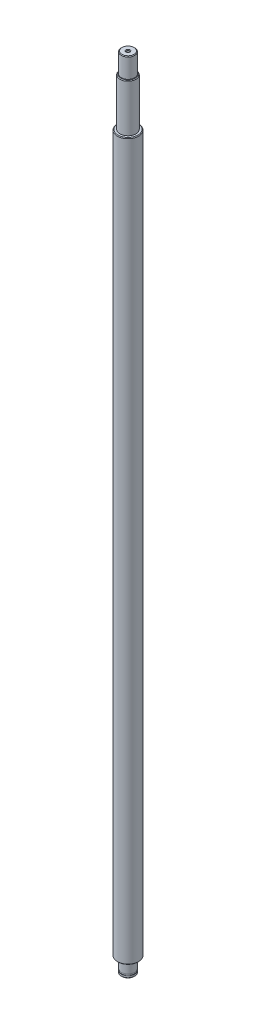
ISO-10303-21;
HEADER;
FILE_DESCRIPTION(('STEP AP214'),'2;1');
FILE_NAME('part.step','',(''),(''),'','','');
FILE_SCHEMA(('AUTOMOTIVE_DESIGN { 1 0 10303 214 1 1 1 1 }'));
ENDSEC;
DATA;
#1=APPLICATION_CONTEXT('core data for automotive mechanical design processes');
#2=APPLICATION_PROTOCOL_DEFINITION('international standard','automotive_design',2000,#1);
#3=PRODUCT_CONTEXT('',#1,'mechanical');
#4=PRODUCT('Part','Part','',(#3));
#5=PRODUCT_RELATED_PRODUCT_CATEGORY('part','',(#4));
#6=PRODUCT_DEFINITION_FORMATION('','',#4);
#7=PRODUCT_DEFINITION_CONTEXT('part definition',#1,'design');
#8=PRODUCT_DEFINITION('design','',#6,#7);
#9=PRODUCT_DEFINITION_SHAPE('','',#8);
#10=(LENGTH_UNIT() NAMED_UNIT(*) SI_UNIT(.MILLI.,.METRE.));
#11=(NAMED_UNIT(*) PLANE_ANGLE_UNIT() SI_UNIT($,.RADIAN.));
#12=(NAMED_UNIT(*) SI_UNIT($,.STERADIAN.) SOLID_ANGLE_UNIT());
#13=UNCERTAINTY_MEASURE_WITH_UNIT(LENGTH_MEASURE(1.E-05),#10,'distance_accuracy_value','');
#14=(GEOMETRIC_REPRESENTATION_CONTEXT(3) GLOBAL_UNCERTAINTY_ASSIGNED_CONTEXT((#13)) GLOBAL_UNIT_ASSIGNED_CONTEXT((#10,
#11,#12)) REPRESENTATION_CONTEXT('',''));
#15=CARTESIAN_POINT('',(0.,0.,0.));
#16=DIRECTION('',(0.,0.,1.));
#17=DIRECTION('',(1.,0.,0.));
#18=AXIS2_PLACEMENT_3D('',#15,#16,#17);
#19=CARTESIAN_POINT('',(0.,-3.,0.));
#20=DIRECTION('',(0.,1.,0.));
#21=DIRECTION('',(-1.,0.,0.));
#22=AXIS2_PLACEMENT_3D('',#19,#20,#21);
#23=CYLINDRICAL_SURFACE('',#22,5.);
#24=CARTESIAN_POINT('',(0.,-0.499999999999902,0.));
#25=DIRECTION('',(0.,1.,0.));
#26=DIRECTION('',(-1.,0.,0.));
#27=AXIS2_PLACEMENT_3D('',#24,#25,#26);
#28=CIRCLE('',#27,5.);
#29=CARTESIAN_POINT('',(-5.,-0.499999999999903,0.));
#30=VERTEX_POINT('',#29);
#31=EDGE_CURVE('E65',#30,#30,#28,.F.);
#32=ORIENTED_EDGE('',*,*,#31,.T.);
#33=EDGE_LOOP('',(#32));
#34=FACE_BOUND('',#33,.T.);
#35=CARTESIAN_POINT('',(0.,-15.,0.));
#36=DIRECTION('',(0.,1.,0.));
#37=DIRECTION('',(-1.,0.,0.));
#38=AXIS2_PLACEMENT_3D('',#35,#36,#37);
#39=CIRCLE('',#38,5.);
#40=CARTESIAN_POINT('',(-5.,-15.,0.));
#41=VERTEX_POINT('',#40);
#42=EDGE_CURVE('E113',#41,#41,#39,.T.);
#43=ORIENTED_EDGE('',*,*,#42,.T.);
#44=EDGE_LOOP('',(#43));
#45=FACE_BOUND('',#44,.T.);
#46=ADVANCED_FACE('F33',(#34,#45),#23,.T.);
#47=CARTESIAN_POINT('',(-5.,0.,0.));
#48=DIRECTION('',(0.,1.,0.));
#49=DIRECTION('',(-1.,0.,0.));
#50=AXIS2_PLACEMENT_3D('',#47,#48,#49);
#51=PLANE('',#50);
#52=CARTESIAN_POINT('',(0.,0.,0.));
#53=DIRECTION('',(0.,1.,0.));
#54=DIRECTION('',(-1.,0.,0.));
#55=AXIS2_PLACEMENT_3D('',#52,#53,#54);
#56=CIRCLE('',#55,1.50000000000006);
#57=CARTESIAN_POINT('',(-1.50000000000006,0.,0.));
#58=VERTEX_POINT('',#57);
#59=EDGE_CURVE('E56',#58,#58,#56,.F.);
#60=ORIENTED_EDGE('',*,*,#59,.T.);
#61=EDGE_LOOP('',(#60));
#62=FACE_BOUND('',#61,.T.);
#63=CARTESIAN_POINT('',(0.,0.,0.));
#64=DIRECTION('',(0.,1.,0.));
#65=DIRECTION('',(-1.,0.,0.));
#66=AXIS2_PLACEMENT_3D('',#63,#64,#65);
#67=CIRCLE('',#66,4.50000000000006);
#68=CARTESIAN_POINT('',(-4.50000000000006,0.,0.));
#69=VERTEX_POINT('',#68);
#70=EDGE_CURVE('E68',#69,#69,#67,.T.);
#71=ORIENTED_EDGE('',*,*,#70,.T.);
#72=EDGE_LOOP('',(#71));
#73=FACE_BOUND('',#72,.T.);
#74=ADVANCED_FACE('F135',(#62,#73),#51,.T.);
#75=CARTESIAN_POINT('',(0.,-3.,0.));
#76=DIRECTION('',(0.,1.,0.));
#77=DIRECTION('',(-1.,0.,0.));
#78=AXIS2_PLACEMENT_3D('',#75,#76,#77);
#79=CYLINDRICAL_SURFACE('',#78,1.);
#80=CARTESIAN_POINT('',(0.,-0.288675134594876,0.));
#81=DIRECTION('',(0.,1.,0.));
#82=DIRECTION('',(-1.,0.,0.));
#83=AXIS2_PLACEMENT_3D('',#80,#81,#82);
#84=CIRCLE('',#83,1.);
#85=CARTESIAN_POINT('',(-1.,-0.288675134594876,0.));
#86=VERTEX_POINT('',#85);
#87=EDGE_CURVE('E59',#86,#86,#84,.T.);
#88=ORIENTED_EDGE('',*,*,#87,.T.);
#89=EDGE_LOOP('',(#88));
#90=FACE_BOUND('',#89,.T.);
#91=CARTESIAN_POINT('',(0.,-2.49999999999997,0.));
#92=DIRECTION('',(0.,1.,0.));
#93=DIRECTION('',(-1.,0.,0.));
#94=AXIS2_PLACEMENT_3D('',#91,#92,#93);
#95=CIRCLE('',#94,1.);
#96=CARTESIAN_POINT('',(-1.,-2.49999999999997,0.));
#97=VERTEX_POINT('',#96);
#98=EDGE_CURVE('E62',#97,#97,#95,.F.);
#99=ORIENTED_EDGE('',*,*,#98,.T.);
#100=EDGE_LOOP('',(#99));
#101=FACE_BOUND('',#100,.T.);
#102=ADVANCED_FACE('F141',(#90,#101),#79,.F.);
#103=CARTESIAN_POINT('',(-1.,-3.,0.));
#104=DIRECTION('',(0.,1.,0.));
#105=DIRECTION('',(-1.,0.,0.));
#106=AXIS2_PLACEMENT_3D('',#103,#104,#105);
#107=PLANE('',#106);
#108=CARTESIAN_POINT('',(0.,-3.,0.));
#109=DIRECTION('',(0.,1.,0.));
#110=DIRECTION('',(-1.,0.,0.));
#111=AXIS2_PLACEMENT_3D('',#108,#109,#110);
#112=CIRCLE('',#111,0.711324865405205);
#113=CARTESIAN_POINT('',(-0.711324865405205,-3.,0.));
#114=VERTEX_POINT('',#113);
#115=EDGE_CURVE('E53',#114,#114,#112,.T.);
#116=ORIENTED_EDGE('',*,*,#115,.T.);
#117=EDGE_LOOP('',(#116));
#118=FACE_BOUND('',#117,.T.);
#119=ADVANCED_FACE('F192',(#118),#107,.T.);
#120=CARTESIAN_POINT('',(0.,-597.,0.));
#121=DIRECTION('',(0.,-1.,0.));
#122=DIRECTION('',(1.,0.,0.));
#123=AXIS2_PLACEMENT_3D('',#120,#121,#122);
#124=PLANE('',#123);
#125=CARTESIAN_POINT('',(0.,-597.,0.));
#126=DIRECTION('',(0.,-1.,0.));
#127=DIRECTION('',(1.,0.,0.));
#128=AXIS2_PLACEMENT_3D('',#125,#126,#127);
#129=CIRCLE('',#128,0.499999999999945);
#130=CARTESIAN_POINT('',(0.500000000000018,-597.,0.));
#131=VERTEX_POINT('',#130);
#132=EDGE_CURVE('E40',#131,#131,#129,.T.);
#133=ORIENTED_EDGE('',*,*,#132,.T.);
#134=EDGE_LOOP('',(#133));
#135=FACE_BOUND('',#134,.T.);
#136=ADVANCED_FACE('F182',(#135),#124,.T.);
#137=CARTESIAN_POINT('',(0.,-3.,0.));
#138=DIRECTION('',(0.,1.,0.));
#139=DIRECTION('',(-1.,0.,0.));
#140=AXIS2_PLACEMENT_3D('',#137,#138,#139);
#141=CYLINDRICAL_SURFACE('',#140,1.);
#142=CARTESIAN_POINT('',(0.,-597.288675134595,0.));
#143=DIRECTION('',(0.,-1.,0.));
#144=DIRECTION('',(1.,0.,0.));
#145=AXIS2_PLACEMENT_3D('',#142,#143,#144);
#146=CIRCLE('',#145,1.);
#147=CARTESIAN_POINT('',(1.00000000000007,-597.288675134595,0.));
#148=VERTEX_POINT('',#147);
#149=EDGE_CURVE('E44',#148,#148,#146,.F.);
#150=ORIENTED_EDGE('',*,*,#149,.T.);
#151=EDGE_LOOP('',(#150));
#152=FACE_BOUND('',#151,.T.);
#153=CARTESIAN_POINT('',(0.,-599.5,0.));
#154=DIRECTION('',(0.,-1.,0.));
#155=DIRECTION('',(1.,0.,0.));
#156=AXIS2_PLACEMENT_3D('',#153,#154,#155);
#157=CIRCLE('',#156,1.);
#158=CARTESIAN_POINT('',(1.00000000000007,-599.5,0.));
#159=VERTEX_POINT('',#158);
#160=EDGE_CURVE('E48',#159,#159,#157,.T.);
#161=ORIENTED_EDGE('',*,*,#160,.T.);
#162=EDGE_LOOP('',(#161));
#163=FACE_BOUND('',#162,.T.);
#164=ADVANCED_FACE('F178',(#152,#163),#141,.F.);
#165=CARTESIAN_POINT('',(-4.99999999999993,-600.,0.));
#166=DIRECTION('',(0.,-1.,0.));
#167=DIRECTION('',(1.,0.,0.));
#168=AXIS2_PLACEMENT_3D('',#165,#166,#167);
#169=PLANE('',#168);
#170=CARTESIAN_POINT('',(0.,-600.,0.));
#171=DIRECTION('',(0.,-1.,0.));
#172=DIRECTION('',(1.,0.,0.));
#173=AXIS2_PLACEMENT_3D('',#170,#171,#172);
#174=CIRCLE('',#173,1.2886751345948);
#175=CARTESIAN_POINT('',(1.28867513459487,-600.,0.));
#176=VERTEX_POINT('',#175);
#177=EDGE_CURVE('E10',#176,#176,#174,.F.);
#178=ORIENTED_EDGE('',*,*,#177,.T.);
#179=EDGE_LOOP('',(#178));
#180=FACE_BOUND('',#179,.T.);
#181=CARTESIAN_POINT('',(0.,-600.,0.));
#182=DIRECTION('',(0.,-1.,0.));
#183=DIRECTION('',(1.,0.,0.));
#184=AXIS2_PLACEMENT_3D('',#181,#182,#183);
#185=CIRCLE('',#184,4.49999999999984);
#186=CARTESIAN_POINT('',(4.49999999999991,-600.,0.));
#187=VERTEX_POINT('',#186);
#188=EDGE_CURVE('E89',#187,#187,#185,.T.);
#189=ORIENTED_EDGE('',*,*,#188,.T.);
#190=EDGE_LOOP('',(#189));
#191=FACE_BOUND('',#190,.T.);
#192=ADVANCED_FACE('F181',(#180,#191),#169,.T.);
#193=CARTESIAN_POINT('',(0.,-3.,0.));
#194=DIRECTION('',(0.,1.,0.));
#195=DIRECTION('',(-1.,0.,0.));
#196=AXIS2_PLACEMENT_3D('',#193,#194,#195);
#197=CYLINDRICAL_SURFACE('',#196,5.);
#198=CARTESIAN_POINT('',(0.,-599.5,0.));
#199=DIRECTION('',(0.,-1.,0.));
#200=DIRECTION('',(1.,0.,0.));
#201=AXIS2_PLACEMENT_3D('',#198,#199,#200);
#202=CIRCLE('',#201,5.);
#203=CARTESIAN_POINT('',(5.00000000000007,-599.5,0.));
#204=VERTEX_POINT('',#203);
#205=EDGE_CURVE('E92',#204,#204,#202,.F.);
#206=ORIENTED_EDGE('',*,*,#205,.T.);
#207=EDGE_LOOP('',(#206));
#208=FACE_BOUND('',#207,.T.);
#209=CARTESIAN_POINT('',(0.,-598.15,0.));
#210=DIRECTION('',(0.,1.,0.));
#211=DIRECTION('',(-1.,0.,0.));
#212=AXIS2_PLACEMENT_3D('',#209,#210,#211);
#213=CIRCLE('',#212,5.);
#214=CARTESIAN_POINT('',(-4.99999999999993,-598.15,0.));
#215=VERTEX_POINT('',#214);
#216=EDGE_CURVE('E95',#215,#215,#213,.T.);
#217=ORIENTED_EDGE('',*,*,#216,.F.);
#218=EDGE_LOOP('',(#217));
#219=FACE_BOUND('',#218,.T.);
#220=ADVANCED_FACE('F190',(#208,#219),#197,.T.);
#221=CARTESIAN_POINT('',(-4.79999999999993,-598.15,0.));
#222=DIRECTION('',(0.,1.,0.));
#223=DIRECTION('',(-1.,0.,0.));
#224=AXIS2_PLACEMENT_3D('',#221,#222,#223);
#225=PLANE('',#224);
#226=ORIENTED_EDGE('',*,*,#216,.T.);
#227=EDGE_LOOP('',(#226));
#228=FACE_BOUND('',#227,.T.);
#229=CARTESIAN_POINT('',(0.,-598.15,0.));
#230=DIRECTION('',(0.,1.,0.));
#231=DIRECTION('',(-1.,0.,0.));
#232=AXIS2_PLACEMENT_3D('',#229,#230,#231);
#233=CIRCLE('',#232,4.8);
#234=CARTESIAN_POINT('',(-4.79999999999993,-598.15,0.));
#235=VERTEX_POINT('',#234);
#236=EDGE_CURVE('E98',#235,#235,#233,.T.);
#237=ORIENTED_EDGE('',*,*,#236,.F.);
#238=EDGE_LOOP('',(#237));
#239=FACE_BOUND('',#238,.T.);
#240=ADVANCED_FACE('F322',(#228,#239),#225,.T.);
#241=CARTESIAN_POINT('',(0.,-3.,0.));
#242=DIRECTION('',(0.,1.,0.));
#243=DIRECTION('',(-1.,0.,0.));
#244=AXIS2_PLACEMENT_3D('',#241,#242,#243);
#245=CYLINDRICAL_SURFACE('',#244,4.8);
#246=ORIENTED_EDGE('',*,*,#236,.T.);
#247=EDGE_LOOP('',(#246));
#248=FACE_BOUND('',#247,.T.);
#249=CARTESIAN_POINT('',(0.,-597.,0.));
#250=DIRECTION('',(0.,1.,0.));
#251=DIRECTION('',(-1.,0.,0.));
#252=AXIS2_PLACEMENT_3D('',#249,#250,#251);
#253=CIRCLE('',#252,4.8);
#254=CARTESIAN_POINT('',(-4.79999999999993,-597.,0.));
#255=VERTEX_POINT('',#254);
#256=EDGE_CURVE('E101',#255,#255,#253,.T.);
#257=ORIENTED_EDGE('',*,*,#256,.F.);
#258=EDGE_LOOP('',(#257));
#259=FACE_BOUND('',#258,.T.);
#260=ADVANCED_FACE('F347',(#248,#259),#245,.T.);
#261=CARTESIAN_POINT('',(-4.99999999999993,-597.,0.));
#262=DIRECTION('',(0.,-1.,0.));
#263=DIRECTION('',(1.,0.,0.));
#264=AXIS2_PLACEMENT_3D('',#261,#262,#263);
#265=PLANE('',#264);
#266=ORIENTED_EDGE('',*,*,#256,.T.);
#267=EDGE_LOOP('',(#266));
#268=FACE_BOUND('',#267,.T.);
#269=CARTESIAN_POINT('',(0.,-597.,0.));
#270=DIRECTION('',(0.,1.,0.));
#271=DIRECTION('',(-1.,0.,0.));
#272=AXIS2_PLACEMENT_3D('',#269,#270,#271);
#273=CIRCLE('',#272,5.);
#274=CARTESIAN_POINT('',(-4.99999999999993,-597.,0.));
#275=VERTEX_POINT('',#274);
#276=EDGE_CURVE('E104',#275,#275,#273,.T.);
#277=ORIENTED_EDGE('',*,*,#276,.F.);
#278=EDGE_LOOP('',(#277));
#279=FACE_BOUND('',#278,.T.);
#280=ADVANCED_FACE('F337',(#268,#279),#265,.T.);
#281=CARTESIAN_POINT('',(0.,-3.,0.));
#282=DIRECTION('',(0.,1.,0.));
#283=DIRECTION('',(-1.,0.,0.));
#284=AXIS2_PLACEMENT_3D('',#281,#282,#283);
#285=CYLINDRICAL_SURFACE('',#284,5.);
#286=ORIENTED_EDGE('',*,*,#276,.T.);
#287=EDGE_LOOP('',(#286));
#288=FACE_BOUND('',#287,.T.);
#289=CARTESIAN_POINT('',(0.,-589.,0.));
#290=DIRECTION('',(0.,1.,0.));
#291=DIRECTION('',(-1.,0.,0.));
#292=AXIS2_PLACEMENT_3D('',#289,#290,#291);
#293=CIRCLE('',#292,5.);
#294=CARTESIAN_POINT('',(-4.99999999999993,-589.,0.));
#295=VERTEX_POINT('',#294);
#296=EDGE_CURVE('E107',#295,#295,#293,.T.);
#297=ORIENTED_EDGE('',*,*,#296,.F.);
#298=EDGE_LOOP('',(#297));
#299=FACE_BOUND('',#298,.T.);
#300=ADVANCED_FACE('F313',(#288,#299),#285,.T.);
#301=CARTESIAN_POINT('',(-7.99999999999993,-589.,0.));
#302=DIRECTION('',(0.,-1.,0.));
#303=DIRECTION('',(1.,0.,0.));
#304=AXIS2_PLACEMENT_3D('',#301,#302,#303);
#305=PLANE('',#304);
#306=CARTESIAN_POINT('',(0.,-589.,0.));
#307=DIRECTION('',(0.,-1.,0.));
#308=DIRECTION('',(1.,0.,0.));
#309=AXIS2_PLACEMENT_3D('',#306,#307,#308);
#310=CIRCLE('',#309,7.50000000000001);
#311=CARTESIAN_POINT('',(7.50000000000008,-589.,0.));
#312=VERTEX_POINT('',#311);
#313=EDGE_CURVE('E80',#312,#312,#310,.T.);
#314=ORIENTED_EDGE('',*,*,#313,.T.);
#315=EDGE_LOOP('',(#314));
#316=FACE_BOUND('',#315,.T.);
#317=ORIENTED_EDGE('',*,*,#296,.T.);
#318=EDGE_LOOP('',(#317));
#319=FACE_BOUND('',#318,.T.);
#320=ADVANCED_FACE('F303',(#316,#319),#305,.T.);
#321=CARTESIAN_POINT('',(0.,-3.,0.));
#322=DIRECTION('',(0.,1.,0.));
#323=DIRECTION('',(-1.,0.,0.));
#324=AXIS2_PLACEMENT_3D('',#321,#322,#323);
#325=CYLINDRICAL_SURFACE('',#324,8.);
#326=CARTESIAN_POINT('',(0.,-588.5,0.));
#327=DIRECTION('',(0.,-1.,0.));
#328=DIRECTION('',(1.,0.,0.));
#329=AXIS2_PLACEMENT_3D('',#326,#327,#328);
#330=CIRCLE('',#329,8.);
#331=CARTESIAN_POINT('',(8.00000000000007,-588.5,0.));
#332=VERTEX_POINT('',#331);
#333=EDGE_CURVE('E83',#332,#332,#330,.F.);
#334=ORIENTED_EDGE('',*,*,#333,.T.);
#335=EDGE_LOOP('',(#334));
#336=FACE_BOUND('',#335,.T.);
#337=CARTESIAN_POINT('',(0.,-51.5,0.));
#338=DIRECTION('',(0.,1.,0.));
#339=DIRECTION('',(-1.,0.,0.));
#340=AXIS2_PLACEMENT_3D('',#337,#338,#339);
#341=CIRCLE('',#340,8.);
#342=CARTESIAN_POINT('',(-7.99999999999999,-51.5,0.));
#343=VERTEX_POINT('',#342);
#344=EDGE_CURVE('E86',#343,#343,#341,.F.);
#345=ORIENTED_EDGE('',*,*,#344,.T.);
#346=EDGE_LOOP('',(#345));
#347=FACE_BOUND('',#346,.T.);
#348=ADVANCED_FACE('F293',(#336,#347),#325,.T.);
#349=CARTESIAN_POINT('',(-7.99999999999999,-51.,0.));
#350=DIRECTION('',(0.,1.,0.));
#351=DIRECTION('',(-1.,0.,0.));
#352=AXIS2_PLACEMENT_3D('',#349,#350,#351);
#353=PLANE('',#352);
#354=CARTESIAN_POINT('',(0.,-51.,0.));
#355=DIRECTION('',(0.,1.,0.));
#356=DIRECTION('',(-1.,0.,0.));
#357=AXIS2_PLACEMENT_3D('',#354,#355,#356);
#358=CIRCLE('',#357,7.5);
#359=CARTESIAN_POINT('',(-7.5,-51.,0.));
#360=VERTEX_POINT('',#359);
#361=EDGE_CURVE('E77',#360,#360,#358,.T.);
#362=ORIENTED_EDGE('',*,*,#361,.T.);
#363=EDGE_LOOP('',(#362));
#364=FACE_BOUND('',#363,.T.);
#365=CARTESIAN_POINT('',(0.,-51.,0.));
#366=DIRECTION('',(0.,1.,0.));
#367=DIRECTION('',(-1.,0.,0.));
#368=AXIS2_PLACEMENT_3D('',#365,#366,#367);
#369=CIRCLE('',#368,6.);
#370=CARTESIAN_POINT('',(-5.99999999999999,-51.,0.));
#371=VERTEX_POINT('',#370);
#372=EDGE_CURVE('E110',#371,#371,#369,.T.);
#373=ORIENTED_EDGE('',*,*,#372,.F.);
#374=EDGE_LOOP('',(#373));
#375=FACE_BOUND('',#374,.T.);
#376=ADVANCED_FACE('F131',(#364,#375),#353,.T.);
#377=CARTESIAN_POINT('',(0.,-3.,0.));
#378=DIRECTION('',(0.,1.,0.));
#379=DIRECTION('',(-1.,0.,0.));
#380=AXIS2_PLACEMENT_3D('',#377,#378,#379);
#381=CYLINDRICAL_SURFACE('',#380,6.);
#382=CARTESIAN_POINT('',(0.,-15.4999999999999,0.));
#383=DIRECTION('',(0.,1.,0.));
#384=DIRECTION('',(-1.,0.,0.));
#385=AXIS2_PLACEMENT_3D('',#382,#383,#384);
#386=CIRCLE('',#385,6.);
#387=CARTESIAN_POINT('',(-6.,-15.4999999999999,0.));
#388=VERTEX_POINT('',#387);
#389=EDGE_CURVE('E71',#388,#388,#386,.F.);
#390=ORIENTED_EDGE('',*,*,#389,.T.);
#391=EDGE_LOOP('',(#390));
#392=FACE_BOUND('',#391,.T.);
#393=ORIENTED_EDGE('',*,*,#372,.T.);
#394=EDGE_LOOP('',(#393));
#395=FACE_BOUND('',#394,.T.);
#396=ADVANCED_FACE('F121',(#392,#395),#381,.T.);
#397=CARTESIAN_POINT('',(-6.,-15.,0.));
#398=DIRECTION('',(0.,1.,0.));
#399=DIRECTION('',(-1.,0.,0.));
#400=AXIS2_PLACEMENT_3D('',#397,#398,#399);
#401=PLANE('',#400);
#402=CARTESIAN_POINT('',(0.,-15.,0.));
#403=DIRECTION('',(0.,1.,0.));
#404=DIRECTION('',(-1.,0.,0.));
#405=AXIS2_PLACEMENT_3D('',#402,#403,#404);
#406=CIRCLE('',#405,5.50000000000012);
#407=CARTESIAN_POINT('',(-5.50000000000011,-15.,0.));
#408=VERTEX_POINT('',#407);
#409=EDGE_CURVE('E74',#408,#408,#406,.T.);
#410=ORIENTED_EDGE('',*,*,#409,.T.);
#411=EDGE_LOOP('',(#410));
#412=FACE_BOUND('',#411,.T.);
#413=ORIENTED_EDGE('',*,*,#42,.F.);
#414=EDGE_LOOP('',(#413));
#415=FACE_BOUND('',#414,.T.);
#416=ADVANCED_FACE('F118',(#412,#415),#401,.T.);
#417=CARTESIAN_POINT('',(0.,-599.5,0.));
#418=DIRECTION('',(0.,1.,0.));
#419=DIRECTION('',(-1.,0.,0.));
#420=AXIS2_PLACEMENT_3D('',#417,#418,#419);
#421=CONICAL_SURFACE('',#420,5.,0.785398163397335);
#422=ORIENTED_EDGE('',*,*,#188,.F.);
#423=EDGE_LOOP('',(#422));
#424=FACE_BOUND('',#423,.T.);
#425=ORIENTED_EDGE('',*,*,#205,.F.);
#426=EDGE_LOOP('',(#425));
#427=FACE_BOUND('',#426,.T.);
#428=ADVANCED_FACE('F120',(#424,#427),#421,.T.);
#429=CARTESIAN_POINT('',(0.,-588.5,0.));
#430=DIRECTION('',(0.,1.,0.));
#431=DIRECTION('',(-1.,0.,0.));
#432=AXIS2_PLACEMENT_3D('',#429,#430,#431);
#433=CONICAL_SURFACE('',#432,8.,0.785398163397499);
#434=ORIENTED_EDGE('',*,*,#313,.F.);
#435=EDGE_LOOP('',(#434));
#436=FACE_BOUND('',#435,.T.);
#437=ORIENTED_EDGE('',*,*,#333,.F.);
#438=EDGE_LOOP('',(#437));
#439=FACE_BOUND('',#438,.T.);
#440=ADVANCED_FACE('F128',(#436,#439),#433,.T.);
#441=CARTESIAN_POINT('',(0.,-51.,0.));
#442=DIRECTION('',(0.,-1.,0.));
#443=DIRECTION('',(1.,0.,0.));
#444=AXIS2_PLACEMENT_3D('',#441,#442,#443);
#445=CONICAL_SURFACE('',#444,7.5,0.785398163397479);
#446=ORIENTED_EDGE('',*,*,#344,.F.);
#447=EDGE_LOOP('',(#446));
#448=FACE_BOUND('',#447,.T.);
#449=ORIENTED_EDGE('',*,*,#361,.F.);
#450=EDGE_LOOP('',(#449));
#451=FACE_BOUND('',#450,.T.);
#452=ADVANCED_FACE('F148',(#448,#451),#445,.T.);
#453=CARTESIAN_POINT('',(0.,-15.,0.));
#454=DIRECTION('',(0.,-1.,0.));
#455=DIRECTION('',(1.,0.,0.));
#456=AXIS2_PLACEMENT_3D('',#453,#454,#455);
#457=CONICAL_SURFACE('',#456,5.50000000000012,0.785398163397426);
#458=ORIENTED_EDGE('',*,*,#389,.F.);
#459=EDGE_LOOP('',(#458));
#460=FACE_BOUND('',#459,.T.);
#461=ORIENTED_EDGE('',*,*,#409,.F.);
#462=EDGE_LOOP('',(#461));
#463=FACE_BOUND('',#462,.T.);
#464=ADVANCED_FACE('F152',(#460,#463),#457,.T.);
#465=CARTESIAN_POINT('',(0.,0.,0.));
#466=DIRECTION('',(0.,-1.,0.));
#467=DIRECTION('',(1.,0.,0.));
#468=AXIS2_PLACEMENT_3D('',#465,#466,#467);
#469=CONICAL_SURFACE('',#468,4.50000000000006,0.785398163397487);
#470=ORIENTED_EDGE('',*,*,#31,.F.);
#471=EDGE_LOOP('',(#470));
#472=FACE_BOUND('',#471,.T.);
#473=ORIENTED_EDGE('',*,*,#70,.F.);
#474=EDGE_LOOP('',(#473));
#475=FACE_BOUND('',#474,.T.);
#476=ADVANCED_FACE('F156',(#472,#475),#469,.T.);
#477=CARTESIAN_POINT('',(0.,-0.288675134594876,0.));
#478=DIRECTION('',(0.,1.,0.));
#479=DIRECTION('',(-1.,0.,0.));
#480=AXIS2_PLACEMENT_3D('',#477,#478,#479);
#481=CONICAL_SURFACE('',#480,1.,1.04719755119655);
#482=ORIENTED_EDGE('',*,*,#59,.F.);
#483=EDGE_LOOP('',(#482));
#484=FACE_BOUND('',#483,.T.);
#485=ORIENTED_EDGE('',*,*,#87,.F.);
#486=EDGE_LOOP('',(#485));
#487=FACE_BOUND('',#486,.T.);
#488=ADVANCED_FACE('F160',(#484,#487),#481,.F.);
#489=CARTESIAN_POINT('',(0.,-3.,0.));
#490=DIRECTION('',(0.,1.,0.));
#491=DIRECTION('',(-1.,0.,0.));
#492=AXIS2_PLACEMENT_3D('',#489,#490,#491);
#493=CONICAL_SURFACE('',#492,0.711324865405205,0.523598775598247);
#494=ORIENTED_EDGE('',*,*,#98,.F.);
#495=EDGE_LOOP('',(#494));
#496=FACE_BOUND('',#495,.T.);
#497=ORIENTED_EDGE('',*,*,#115,.F.);
#498=EDGE_LOOP('',(#497));
#499=FACE_BOUND('',#498,.T.);
#500=ADVANCED_FACE('F164',(#496,#499),#493,.F.);
#501=CARTESIAN_POINT('',(0.,-597.288675134595,0.));
#502=DIRECTION('',(0.,-1.,0.));
#503=DIRECTION('',(1.,0.,0.));
#504=AXIS2_PLACEMENT_3D('',#501,#502,#503);
#505=CONICAL_SURFACE('',#504,1.,1.04719755119659);
#506=ORIENTED_EDGE('',*,*,#132,.F.);
#507=EDGE_LOOP('',(#506));
#508=FACE_BOUND('',#507,.T.);
#509=ORIENTED_EDGE('',*,*,#149,.F.);
#510=EDGE_LOOP('',(#509));
#511=FACE_BOUND('',#510,.T.);
#512=ADVANCED_FACE('F167',(#508,#511),#505,.F.);
#513=CARTESIAN_POINT('',(0.,-600.,0.));
#514=DIRECTION('',(0.,-1.,0.));
#515=DIRECTION('',(1.,0.,0.));
#516=AXIS2_PLACEMENT_3D('',#513,#514,#515);
#517=CONICAL_SURFACE('',#516,1.2886751345948,0.523598775598226);
#518=ORIENTED_EDGE('',*,*,#160,.F.);
#519=EDGE_LOOP('',(#518));
#520=FACE_BOUND('',#519,.T.);
#521=ORIENTED_EDGE('',*,*,#177,.F.);
#522=EDGE_LOOP('',(#521));
#523=FACE_BOUND('',#522,.T.);
#524=ADVANCED_FACE('F35',(#520,#523),#517,.F.);
#525=CLOSED_SHELL('',(#46,#74,#102,#119,#136,#164,#192,#220,#240,#260,#280,#300,#320,#348,#376,
#396,#416,#428,#440,#452,#464,#476,#488,#500,#512,#524));
#526=MANIFOLD_SOLID_BREP('B2',#525);
#527=ADVANCED_BREP_SHAPE_REPRESENTATION('',(#18,#526),#14);
#528=SHAPE_DEFINITION_REPRESENTATION(#9,#527);
ENDSEC;
END-ISO-10303-21;
